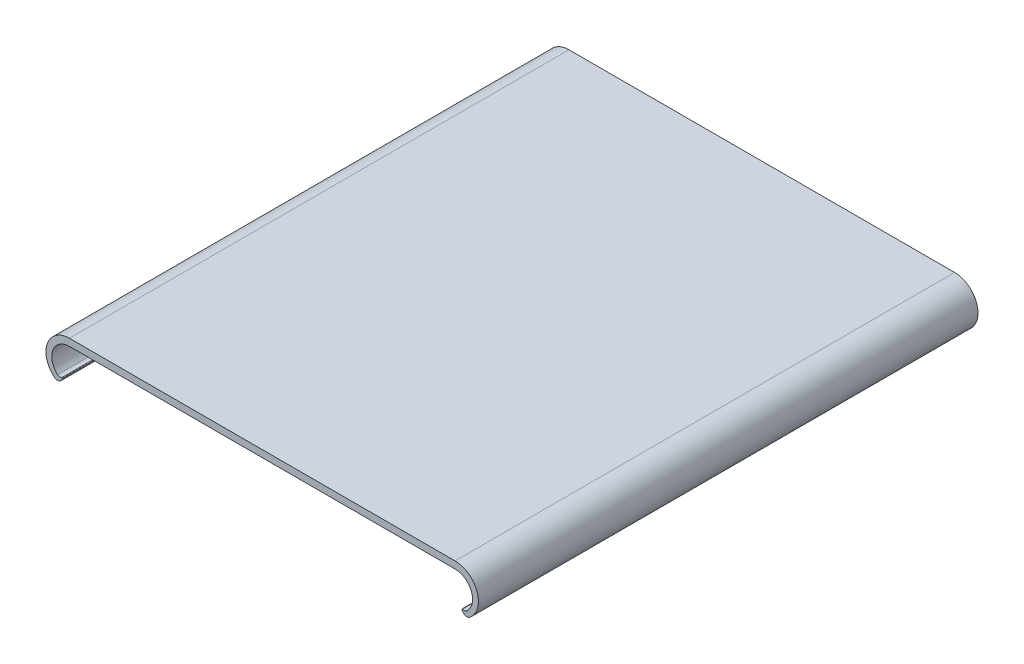
ISO-10303-21;
HEADER;
FILE_DESCRIPTION(('STEP AP214'),'2;1');
FILE_NAME('part.step','',(''),(''),'','','');
FILE_SCHEMA(('AUTOMOTIVE_DESIGN { 1 0 10303 214 1 1 1 1 }'));
ENDSEC;
DATA;
#1=APPLICATION_CONTEXT('core data for automotive mechanical design processes');
#2=APPLICATION_PROTOCOL_DEFINITION('international standard','automotive_design',2000,#1);
#3=PRODUCT_CONTEXT('',#1,'mechanical');
#4=PRODUCT('Part','Part','',(#3));
#5=PRODUCT_RELATED_PRODUCT_CATEGORY('part','',(#4));
#6=PRODUCT_DEFINITION_FORMATION('','',#4);
#7=PRODUCT_DEFINITION_CONTEXT('part definition',#1,'design');
#8=PRODUCT_DEFINITION('design','',#6,#7);
#9=PRODUCT_DEFINITION_SHAPE('','',#8);
#10=(LENGTH_UNIT() NAMED_UNIT(*) SI_UNIT(.MILLI.,.METRE.));
#11=(NAMED_UNIT(*) PLANE_ANGLE_UNIT() SI_UNIT($,.RADIAN.));
#12=(NAMED_UNIT(*) SI_UNIT($,.STERADIAN.) SOLID_ANGLE_UNIT());
#13=UNCERTAINTY_MEASURE_WITH_UNIT(LENGTH_MEASURE(1.E-05),#10,'distance_accuracy_value','');
#14=(GEOMETRIC_REPRESENTATION_CONTEXT(3) GLOBAL_UNCERTAINTY_ASSIGNED_CONTEXT((#13)) GLOBAL_UNIT_ASSIGNED_CONTEXT((#10,
#11,#12)) REPRESENTATION_CONTEXT('',''));
#15=CARTESIAN_POINT('',(0.,0.,0.));
#16=DIRECTION('',(0.,0.,1.));
#17=DIRECTION('',(1.,0.,0.));
#18=AXIS2_PLACEMENT_3D('',#15,#16,#17);
#19=CARTESIAN_POINT('',(-33.,-4.00000000000001,42.75));
#20=DIRECTION('',(0.,0.,-1.));
#21=DIRECTION('',(-1.,0.,0.));
#22=AXIS2_PLACEMENT_3D('',#19,#20,#21);
#23=CYLINDRICAL_SURFACE('',#22,3.99999999999999);
#24=CARTESIAN_POINT('',(-33.,-4.00000000000001,-42.75));
#25=DIRECTION('',(0.,0.,1.));
#26=DIRECTION('',(1.,0.,0.));
#27=AXIS2_PLACEMENT_3D('',#24,#25,#26);
#28=CIRCLE('',#27,3.99999999999999);
#29=CARTESIAN_POINT('',(-33.,0.,-42.75));
#30=VERTEX_POINT('',#29);
#31=CARTESIAN_POINT('',(-35.5813911456641,-7.05555555555562,-42.75));
#32=VERTEX_POINT('',#31);
#33=EDGE_CURVE('E164',#30,#32,#28,.T.);
#34=ORIENTED_EDGE('',*,*,#33,.T.);
#35=DIRECTION('',(0.,0.,-1.));
#36=VECTOR('',#35,1.);
#37=CARTESIAN_POINT('',(-35.5813911456641,-7.05555555555562,42.75));
#38=LINE('',#37,#36);
#39=CARTESIAN_POINT('',(-35.5813911456641,-7.05555555555562,42.75));
#40=VERTEX_POINT('',#39);
#41=EDGE_CURVE('E11',#40,#32,#38,.T.);
#42=ORIENTED_EDGE('',*,*,#41,.F.);
#43=CARTESIAN_POINT('',(-33.,-4.00000000000001,42.75));
#44=DIRECTION('',(0.,0.,1.));
#45=DIRECTION('',(1.,0.,0.));
#46=AXIS2_PLACEMENT_3D('',#43,#44,#45);
#47=CIRCLE('',#46,3.99999999999999);
#48=CARTESIAN_POINT('',(-33.,0.,42.75));
#49=VERTEX_POINT('',#48);
#50=EDGE_CURVE('E198',#49,#40,#47,.T.);
#51=ORIENTED_EDGE('',*,*,#50,.F.);
#52=DIRECTION('',(0.,0.,-1.));
#53=VECTOR('',#52,1.);
#54=CARTESIAN_POINT('',(-33.,0.,42.75));
#55=LINE('',#54,#53);
#56=EDGE_CURVE('E160',#49,#30,#55,.T.);
#57=ORIENTED_EDGE('',*,*,#56,.T.);
#58=EDGE_LOOP('',(#34,#42,#51,#57));
#59=FACE_BOUND('',#58,.T.);
#60=ADVANCED_FACE('F39',(#59),#23,.T.);
#61=CARTESIAN_POINT('',(-35.0328455272105,-6.40625000000007,42.75));
#62=DIRECTION('',(0.,0.,-1.));
#63=DIRECTION('',(-1.,0.,0.));
#64=AXIS2_PLACEMENT_3D('',#61,#62,#63);
#65=CYLINDRICAL_SURFACE('',#64,0.849999999999977);
#66=CARTESIAN_POINT('',(-35.0328455272105,-6.40625000000007,-42.75));
#67=DIRECTION('',(0.,0.,1.));
#68=DIRECTION('',(1.,0.,0.));
#69=AXIS2_PLACEMENT_3D('',#66,#67,#68);
#70=CIRCLE('',#69,0.849999999999977);
#71=CARTESIAN_POINT('',(-34.1975403046777,-6.56361958158892,-42.75));
#72=VERTEX_POINT('',#71);
#73=EDGE_CURVE('E168',#32,#72,#70,.T.);
#74=ORIENTED_EDGE('',*,*,#73,.T.);
#75=DIRECTION('',(0.,0.,-1.));
#76=VECTOR('',#75,1.);
#77=CARTESIAN_POINT('',(-34.1975403046777,-6.56361958158892,42.75));
#78=LINE('',#77,#76);
#79=CARTESIAN_POINT('',(-34.1975403046777,-6.56361958158892,42.75));
#80=VERTEX_POINT('',#79);
#81=EDGE_CURVE('E48',#80,#72,#78,.T.);
#82=ORIENTED_EDGE('',*,*,#81,.F.);
#83=CARTESIAN_POINT('',(-35.0328455272105,-6.40625000000007,42.75));
#84=DIRECTION('',(0.,0.,1.));
#85=DIRECTION('',(1.,0.,0.));
#86=AXIS2_PLACEMENT_3D('',#83,#84,#85);
#87=CIRCLE('',#86,0.849999999999977);
#88=EDGE_CURVE('E111',#40,#80,#87,.T.);
#89=ORIENTED_EDGE('',*,*,#88,.F.);
#90=ORIENTED_EDGE('',*,*,#41,.T.);
#91=EDGE_LOOP('',(#74,#82,#89,#90));
#92=FACE_BOUND('',#91,.T.);
#93=ADVANCED_FACE('F292',(#92),#65,.T.);
#94=CARTESIAN_POINT('',(-34.2761572667985,-6.54880832685115,42.75));
#95=DIRECTION('',(0.,0.,-1.));
#96=DIRECTION('',(-1.,0.,0.));
#97=AXIS2_PLACEMENT_3D('',#94,#95,#96);
#98=CYLINDRICAL_SURFACE('',#97,0.0799999999999969);
#99=CARTESIAN_POINT('',(-34.2761572667985,-6.54880832685115,-42.75));
#100=DIRECTION('',(0.,0.,1.));
#101=DIRECTION('',(1.,0.,0.));
#102=AXIS2_PLACEMENT_3D('',#99,#100,#101);
#103=CIRCLE('',#102,0.0799999999999969);
#104=CARTESIAN_POINT('',(-34.3172019661409,-6.4801400470133,-42.75));
#105=VERTEX_POINT('',#104);
#106=EDGE_CURVE('E171',#72,#105,#103,.T.);
#107=ORIENTED_EDGE('',*,*,#106,.T.);
#108=DIRECTION('',(0.,0.,-1.));
#109=VECTOR('',#108,1.);
#110=CARTESIAN_POINT('',(-34.3172019661409,-6.4801400470133,42.75));
#111=LINE('',#110,#109);
#112=CARTESIAN_POINT('',(-34.3172019661409,-6.4801400470133,42.75));
#113=VERTEX_POINT('',#112);
#114=EDGE_CURVE('E225',#113,#105,#111,.T.);
#115=ORIENTED_EDGE('',*,*,#114,.F.);
#116=CARTESIAN_POINT('',(-34.2761572667985,-6.54880832685115,42.75));
#117=DIRECTION('',(0.,0.,1.));
#118=DIRECTION('',(1.,0.,0.));
#119=AXIS2_PLACEMENT_3D('',#116,#117,#118);
#120=CIRCLE('',#119,0.0799999999999969);
#121=EDGE_CURVE('E235',#80,#113,#120,.T.);
#122=ORIENTED_EDGE('',*,*,#121,.F.);
#123=ORIENTED_EDGE('',*,*,#81,.T.);
#124=EDGE_LOOP('',(#107,#115,#122,#123));
#125=FACE_BOUND('',#124,.T.);
#126=ADVANCED_FACE('F233',(#125),#98,.T.);
#127=CARTESIAN_POINT('',(-34.6255711842818,-5.96423460480208,42.75));
#128=DIRECTION('',(0.,0.,-1.));
#129=DIRECTION('',(-1.,0.,0.));
#130=AXIS2_PLACEMENT_3D('',#127,#128,#129);
#131=CYLINDRICAL_SURFACE('',#130,0.601040764008578);
#132=CARTESIAN_POINT('',(-34.6255711842818,-5.96423460480208,-42.75));
#133=DIRECTION('',(0.,0.,-1.));
#134=DIRECTION('',(1.,0.,0.));
#135=AXIS2_PLACEMENT_3D('',#132,#133,#134);
#136=CIRCLE('',#135,0.601040764008578);
#137=CARTESIAN_POINT('',(-35.0328455272105,-6.40625000000006,-42.75));
#138=VERTEX_POINT('',#137);
#139=EDGE_CURVE('E174',#105,#138,#136,.T.);
#140=ORIENTED_EDGE('',*,*,#139,.T.);
#141=DIRECTION('',(0.,0.,-1.));
#142=VECTOR('',#141,1.);
#143=CARTESIAN_POINT('',(-35.0328455272105,-6.40625000000006,42.75));
#144=LINE('',#143,#142);
#145=CARTESIAN_POINT('',(-35.0328455272105,-6.40625000000006,42.75));
#146=VERTEX_POINT('',#145);
#147=EDGE_CURVE('E221',#146,#138,#144,.T.);
#148=ORIENTED_EDGE('',*,*,#147,.F.);
#149=CARTESIAN_POINT('',(-34.6255711842818,-5.96423460480208,42.75));
#150=DIRECTION('',(0.,0.,-1.));
#151=DIRECTION('',(1.,0.,0.));
#152=AXIS2_PLACEMENT_3D('',#149,#150,#151);
#153=CIRCLE('',#152,0.601040764008578);
#154=EDGE_CURVE('E254',#113,#146,#153,.T.);
#155=ORIENTED_EDGE('',*,*,#154,.F.);
#156=ORIENTED_EDGE('',*,*,#114,.T.);
#157=EDGE_LOOP('',(#140,#148,#155,#156));
#158=FACE_BOUND('',#157,.T.);
#159=ADVANCED_FACE('F244',(#158),#131,.F.);
#160=CARTESIAN_POINT('',(-33.,-4.20000000000001,42.75));
#161=DIRECTION('',(0.,0.,-1.));
#162=DIRECTION('',(-1.,0.,0.));
#163=AXIS2_PLACEMENT_3D('',#160,#161,#162);
#164=CYLINDRICAL_SURFACE('',#163,3.00000000000001);
#165=CARTESIAN_POINT('',(-33.,-4.20000000000001,-42.75));
#166=DIRECTION('',(0.,0.,-1.));
#167=DIRECTION('',(1.,0.,0.));
#168=AXIS2_PLACEMENT_3D('',#165,#166,#167);
#169=CIRCLE('',#168,3.00000000000001);
#170=CARTESIAN_POINT('',(-33.,-1.20000000000001,-42.75));
#171=VERTEX_POINT('',#170);
#172=EDGE_CURVE('E177',#138,#171,#169,.T.);
#173=ORIENTED_EDGE('',*,*,#172,.T.);
#174=DIRECTION('',(0.,0.,-1.));
#175=VECTOR('',#174,1.);
#176=CARTESIAN_POINT('',(-33.,-1.20000000000001,42.75));
#177=LINE('',#176,#175);
#178=CARTESIAN_POINT('',(-33.,-1.20000000000001,42.75));
#179=VERTEX_POINT('',#178);
#180=EDGE_CURVE('E217',#179,#171,#177,.T.);
#181=ORIENTED_EDGE('',*,*,#180,.F.);
#182=CARTESIAN_POINT('',(-33.,-4.20000000000001,42.75));
#183=DIRECTION('',(0.,0.,-1.));
#184=DIRECTION('',(1.,0.,0.));
#185=AXIS2_PLACEMENT_3D('',#182,#183,#184);
#186=CIRCLE('',#185,3.00000000000001);
#187=EDGE_CURVE('E250',#146,#179,#186,.T.);
#188=ORIENTED_EDGE('',*,*,#187,.F.);
#189=ORIENTED_EDGE('',*,*,#147,.T.);
#190=EDGE_LOOP('',(#173,#181,#188,#189));
#191=FACE_BOUND('',#190,.T.);
#192=ADVANCED_FACE('F248',(#191),#164,.F.);
#193=CARTESIAN_POINT('',(33.,-1.2,42.75));
#194=DIRECTION('',(0.,1.,0.));
#195=DIRECTION('',(-1.,0.,0.));
#196=AXIS2_PLACEMENT_3D('',#193,#194,#195);
#197=PLANE('',#196);
#198=DIRECTION('',(1.,0.,0.));
#199=VECTOR('',#198,1.);
#200=CARTESIAN_POINT('',(33.,-1.2,-42.75));
#201=LINE('',#200,#199);
#202=CARTESIAN_POINT('',(33.,-1.19999999999999,-42.75));
#203=VERTEX_POINT('',#202);
#204=EDGE_CURVE('E180',#171,#203,#201,.T.);
#205=ORIENTED_EDGE('',*,*,#204,.T.);
#206=DIRECTION('',(0.,0.,-1.));
#207=VECTOR('',#206,1.);
#208=CARTESIAN_POINT('',(33.,-1.19999999999999,42.75));
#209=LINE('',#208,#207);
#210=CARTESIAN_POINT('',(33.,-1.19999999999999,42.75));
#211=VERTEX_POINT('',#210);
#212=EDGE_CURVE('E213',#211,#203,#209,.T.);
#213=ORIENTED_EDGE('',*,*,#212,.F.);
#214=DIRECTION('',(1.,0.,0.));
#215=VECTOR('',#214,1.);
#216=CARTESIAN_POINT('',(33.,-1.2,42.75));
#217=LINE('',#216,#215);
#218=EDGE_CURVE('E253',#179,#211,#217,.T.);
#219=ORIENTED_EDGE('',*,*,#218,.F.);
#220=ORIENTED_EDGE('',*,*,#180,.T.);
#221=EDGE_LOOP('',(#205,#213,#219,#220));
#222=FACE_BOUND('',#221,.T.);
#223=ADVANCED_FACE('F305',(#222),#197,.F.);
#224=CARTESIAN_POINT('',(33.,-4.2,42.75));
#225=DIRECTION('',(0.,0.,-1.));
#226=DIRECTION('',(-1.,0.,0.));
#227=AXIS2_PLACEMENT_3D('',#224,#225,#226);
#228=CYLINDRICAL_SURFACE('',#227,3.00000000000001);
#229=CARTESIAN_POINT('',(33.,-4.2,-42.75));
#230=DIRECTION('',(0.,0.,-1.));
#231=DIRECTION('',(-1.,0.,0.));
#232=AXIS2_PLACEMENT_3D('',#229,#230,#231);
#233=CIRCLE('',#232,3.00000000000001);
#234=CARTESIAN_POINT('',(35.0328455272105,-6.40625000000006,-42.75));
#235=VERTEX_POINT('',#234);
#236=EDGE_CURVE('E183',#203,#235,#233,.T.);
#237=ORIENTED_EDGE('',*,*,#236,.T.);
#238=DIRECTION('',(0.,0.,-1.));
#239=VECTOR('',#238,1.);
#240=CARTESIAN_POINT('',(35.0328455272105,-6.40625000000006,42.75));
#241=LINE('',#240,#239);
#242=CARTESIAN_POINT('',(35.0328455272105,-6.40625000000006,42.75));
#243=VERTEX_POINT('',#242);
#244=EDGE_CURVE('E209',#243,#235,#241,.T.);
#245=ORIENTED_EDGE('',*,*,#244,.F.);
#246=CARTESIAN_POINT('',(33.,-4.2,42.75));
#247=DIRECTION('',(0.,0.,-1.));
#248=DIRECTION('',(-1.,0.,0.));
#249=AXIS2_PLACEMENT_3D('',#246,#247,#248);
#250=CIRCLE('',#249,3.00000000000001);
#251=EDGE_CURVE('E258',#211,#243,#250,.T.);
#252=ORIENTED_EDGE('',*,*,#251,.F.);
#253=ORIENTED_EDGE('',*,*,#212,.T.);
#254=EDGE_LOOP('',(#237,#245,#252,#253));
#255=FACE_BOUND('',#254,.T.);
#256=ADVANCED_FACE('F308',(#255),#228,.F.);
#257=CARTESIAN_POINT('',(34.6255711842819,-5.96423460480207,42.75));
#258=DIRECTION('',(0.,0.,-1.));
#259=DIRECTION('',(-1.,0.,0.));
#260=AXIS2_PLACEMENT_3D('',#257,#258,#259);
#261=CYLINDRICAL_SURFACE('',#260,0.601040764008578);
#262=CARTESIAN_POINT('',(34.6255711842819,-5.96423460480207,-42.75));
#263=DIRECTION('',(0.,0.,-1.));
#264=DIRECTION('',(-1.,0.,0.));
#265=AXIS2_PLACEMENT_3D('',#262,#263,#264);
#266=CIRCLE('',#265,0.601040764008578);
#267=CARTESIAN_POINT('',(34.3172019661409,-6.48014004701329,-42.75));
#268=VERTEX_POINT('',#267);
#269=EDGE_CURVE('E186',#235,#268,#266,.T.);
#270=ORIENTED_EDGE('',*,*,#269,.T.);
#271=DIRECTION('',(0.,0.,-1.));
#272=VECTOR('',#271,1.);
#273=CARTESIAN_POINT('',(34.3172019661409,-6.48014004701329,42.75));
#274=LINE('',#273,#272);
#275=CARTESIAN_POINT('',(34.3172019661409,-6.48014004701329,42.75));
#276=VERTEX_POINT('',#275);
#277=EDGE_CURVE('E205',#276,#268,#274,.T.);
#278=ORIENTED_EDGE('',*,*,#277,.F.);
#279=CARTESIAN_POINT('',(34.6255711842819,-5.96423460480207,42.75));
#280=DIRECTION('',(0.,0.,-1.));
#281=DIRECTION('',(-1.,0.,0.));
#282=AXIS2_PLACEMENT_3D('',#279,#280,#281);
#283=CIRCLE('',#282,0.601040764008578);
#284=EDGE_CURVE('E265',#243,#276,#283,.T.);
#285=ORIENTED_EDGE('',*,*,#284,.F.);
#286=ORIENTED_EDGE('',*,*,#244,.T.);
#287=EDGE_LOOP('',(#270,#278,#285,#286));
#288=FACE_BOUND('',#287,.T.);
#289=ADVANCED_FACE('F273',(#288),#261,.F.);
#290=CARTESIAN_POINT('',(34.2761572667985,-6.54880832685114,42.75));
#291=DIRECTION('',(0.,0.,-1.));
#292=DIRECTION('',(-1.,0.,0.));
#293=AXIS2_PLACEMENT_3D('',#290,#291,#292);
#294=CYLINDRICAL_SURFACE('',#293,0.0799999999999969);
#295=CARTESIAN_POINT('',(34.2761572667985,-6.54880832685114,-42.75));
#296=DIRECTION('',(0.,0.,1.));
#297=DIRECTION('',(-1.,0.,0.));
#298=AXIS2_PLACEMENT_3D('',#295,#296,#297);
#299=CIRCLE('',#298,0.0799999999999969);
#300=CARTESIAN_POINT('',(34.1975403046778,-6.56361958158891,-42.75));
#301=VERTEX_POINT('',#300);
#302=EDGE_CURVE('E189',#268,#301,#299,.T.);
#303=ORIENTED_EDGE('',*,*,#302,.T.);
#304=DIRECTION('',(0.,0.,-1.));
#305=VECTOR('',#304,1.);
#306=CARTESIAN_POINT('',(34.1975403046778,-6.56361958158891,42.75));
#307=LINE('',#306,#305);
#308=CARTESIAN_POINT('',(34.1975403046778,-6.56361958158891,42.75));
#309=VERTEX_POINT('',#308);
#310=EDGE_CURVE('E153',#309,#301,#307,.T.);
#311=ORIENTED_EDGE('',*,*,#310,.F.);
#312=CARTESIAN_POINT('',(34.2761572667985,-6.54880832685114,42.75));
#313=DIRECTION('',(0.,0.,1.));
#314=DIRECTION('',(-1.,0.,0.));
#315=AXIS2_PLACEMENT_3D('',#312,#313,#314);
#316=CIRCLE('',#315,0.0799999999999969);
#317=EDGE_CURVE('E142',#276,#309,#316,.T.);
#318=ORIENTED_EDGE('',*,*,#317,.F.);
#319=ORIENTED_EDGE('',*,*,#277,.T.);
#320=EDGE_LOOP('',(#303,#311,#318,#319));
#321=FACE_BOUND('',#320,.T.);
#322=ADVANCED_FACE('F277',(#321),#294,.T.);
#323=CARTESIAN_POINT('',(35.0328455272105,-6.40625000000006,42.75));
#324=DIRECTION('',(0.,0.,-1.));
#325=DIRECTION('',(-1.,0.,0.));
#326=AXIS2_PLACEMENT_3D('',#323,#324,#325);
#327=CYLINDRICAL_SURFACE('',#326,0.849999999999977);
#328=CARTESIAN_POINT('',(35.0328455272105,-6.40625000000006,-42.75));
#329=DIRECTION('',(0.,0.,1.));
#330=DIRECTION('',(-1.,0.,0.));
#331=AXIS2_PLACEMENT_3D('',#328,#329,#330);
#332=CIRCLE('',#331,0.849999999999977);
#333=CARTESIAN_POINT('',(35.5813911456641,-7.05555555555561,-42.75));
#334=VERTEX_POINT('',#333);
#335=EDGE_CURVE('E151',#301,#334,#332,.T.);
#336=ORIENTED_EDGE('',*,*,#335,.T.);
#337=DIRECTION('',(0.,0.,-1.));
#338=VECTOR('',#337,1.);
#339=CARTESIAN_POINT('',(35.5813911456641,-7.05555555555561,42.75));
#340=LINE('',#339,#338);
#341=CARTESIAN_POINT('',(35.5813911456641,-7.05555555555561,42.75));
#342=VERTEX_POINT('',#341);
#343=EDGE_CURVE('E148',#342,#334,#340,.T.);
#344=ORIENTED_EDGE('',*,*,#343,.F.);
#345=CARTESIAN_POINT('',(35.0328455272105,-6.40625000000006,42.75));
#346=DIRECTION('',(0.,0.,1.));
#347=DIRECTION('',(-1.,0.,0.));
#348=AXIS2_PLACEMENT_3D('',#345,#346,#347);
#349=CIRCLE('',#348,0.849999999999977);
#350=EDGE_CURVE('E136',#309,#342,#349,.T.);
#351=ORIENTED_EDGE('',*,*,#350,.F.);
#352=ORIENTED_EDGE('',*,*,#310,.T.);
#353=EDGE_LOOP('',(#336,#344,#351,#352));
#354=FACE_BOUND('',#353,.T.);
#355=ADVANCED_FACE('F149',(#354),#327,.T.);
#356=CARTESIAN_POINT('',(33.,-4.,42.75));
#357=DIRECTION('',(0.,0.,-1.));
#358=DIRECTION('',(-1.,0.,0.));
#359=AXIS2_PLACEMENT_3D('',#356,#357,#358);
#360=CYLINDRICAL_SURFACE('',#359,3.99999999999999);
#361=CARTESIAN_POINT('',(33.,-4.,-42.75));
#362=DIRECTION('',(0.,0.,1.));
#363=DIRECTION('',(-1.,0.,0.));
#364=AXIS2_PLACEMENT_3D('',#361,#362,#363);
#365=CIRCLE('',#364,3.99999999999999);
#366=CARTESIAN_POINT('',(33.,0.,-42.75));
#367=VERTEX_POINT('',#366);
#368=EDGE_CURVE('E97',#334,#367,#365,.T.);
#369=ORIENTED_EDGE('',*,*,#368,.T.);
#370=DIRECTION('',(0.,0.,-1.));
#371=VECTOR('',#370,1.);
#372=CARTESIAN_POINT('',(33.,0.,42.75));
#373=LINE('',#372,#371);
#374=CARTESIAN_POINT('',(33.,0.,42.75));
#375=VERTEX_POINT('',#374);
#376=EDGE_CURVE('E154',#375,#367,#373,.T.);
#377=ORIENTED_EDGE('',*,*,#376,.F.);
#378=CARTESIAN_POINT('',(33.,-4.,42.75));
#379=DIRECTION('',(0.,0.,1.));
#380=DIRECTION('',(-1.,0.,0.));
#381=AXIS2_PLACEMENT_3D('',#378,#379,#380);
#382=CIRCLE('',#381,3.99999999999999);
#383=EDGE_CURVE('E140',#342,#375,#382,.T.);
#384=ORIENTED_EDGE('',*,*,#383,.F.);
#385=ORIENTED_EDGE('',*,*,#343,.T.);
#386=EDGE_LOOP('',(#369,#377,#384,#385));
#387=FACE_BOUND('',#386,.T.);
#388=ADVANCED_FACE('F156',(#387),#360,.T.);
#389=CARTESIAN_POINT('',(33.,0.,42.75));
#390=DIRECTION('',(0.,-1.,0.));
#391=DIRECTION('',(1.,0.,0.));
#392=AXIS2_PLACEMENT_3D('',#389,#390,#391);
#393=PLANE('',#392);
#394=DIRECTION('',(-1.,0.,0.));
#395=VECTOR('',#394,1.);
#396=CARTESIAN_POINT('',(33.,0.,-42.75));
#397=LINE('',#396,#395);
#398=EDGE_CURVE('E103',#367,#30,#397,.T.);
#399=ORIENTED_EDGE('',*,*,#398,.T.);
#400=ORIENTED_EDGE('',*,*,#56,.F.);
#401=DIRECTION('',(-1.,0.,0.));
#402=VECTOR('',#401,1.);
#403=CARTESIAN_POINT('',(33.,0.,42.75));
#404=LINE('',#403,#402);
#405=EDGE_CURVE('E56',#375,#49,#404,.T.);
#406=ORIENTED_EDGE('',*,*,#405,.F.);
#407=ORIENTED_EDGE('',*,*,#376,.T.);
#408=EDGE_LOOP('',(#399,#400,#406,#407));
#409=FACE_BOUND('',#408,.T.);
#410=ADVANCED_FACE('F281',(#409),#393,.F.);
#411=CARTESIAN_POINT('',(-33.,-4.00000000000001,42.75));
#412=DIRECTION('',(0.,0.,1.));
#413=DIRECTION('',(1.,0.,0.));
#414=AXIS2_PLACEMENT_3D('',#411,#412,#413);
#415=PLANE('',#414);
#416=ORIENTED_EDGE('',*,*,#50,.T.);
#417=ORIENTED_EDGE('',*,*,#88,.T.);
#418=ORIENTED_EDGE('',*,*,#121,.T.);
#419=ORIENTED_EDGE('',*,*,#154,.T.);
#420=ORIENTED_EDGE('',*,*,#187,.T.);
#421=ORIENTED_EDGE('',*,*,#218,.T.);
#422=ORIENTED_EDGE('',*,*,#251,.T.);
#423=ORIENTED_EDGE('',*,*,#284,.T.);
#424=ORIENTED_EDGE('',*,*,#317,.T.);
#425=ORIENTED_EDGE('',*,*,#350,.T.);
#426=ORIENTED_EDGE('',*,*,#383,.T.);
#427=ORIENTED_EDGE('',*,*,#405,.T.);
#428=EDGE_LOOP('',(#416,#417,#418,#419,#420,#421,#422,#423,#424,#425,#426,#427));
#429=FACE_BOUND('',#428,.T.);
#430=ADVANCED_FACE('F138',(#429),#415,.T.);
#431=CARTESIAN_POINT('',(-33.,-4.00000000000001,-42.75));
#432=DIRECTION('',(0.,0.,1.));
#433=DIRECTION('',(1.,0.,0.));
#434=AXIS2_PLACEMENT_3D('',#431,#432,#433);
#435=PLANE('',#434);
#436=ORIENTED_EDGE('',*,*,#33,.F.);
#437=ORIENTED_EDGE('',*,*,#398,.F.);
#438=ORIENTED_EDGE('',*,*,#368,.F.);
#439=ORIENTED_EDGE('',*,*,#335,.F.);
#440=ORIENTED_EDGE('',*,*,#302,.F.);
#441=ORIENTED_EDGE('',*,*,#269,.F.);
#442=ORIENTED_EDGE('',*,*,#236,.F.);
#443=ORIENTED_EDGE('',*,*,#204,.F.);
#444=ORIENTED_EDGE('',*,*,#172,.F.);
#445=ORIENTED_EDGE('',*,*,#139,.F.);
#446=ORIENTED_EDGE('',*,*,#106,.F.);
#447=ORIENTED_EDGE('',*,*,#73,.F.);
#448=EDGE_LOOP('',(#436,#437,#438,#439,#440,#441,#442,#443,#444,#445,#446,#447));
#449=FACE_BOUND('',#448,.T.);
#450=ADVANCED_FACE('F239',(#449),#435,.F.);
#451=CLOSED_SHELL('',(#60,#93,#126,#159,#192,#223,#256,#289,#322,#355,#388,#410,#430,#450));
#452=MANIFOLD_SOLID_BREP('B2',#451);
#453=ADVANCED_BREP_SHAPE_REPRESENTATION('',(#18,#452),#14);
#454=SHAPE_DEFINITION_REPRESENTATION(#9,#453);
ENDSEC;
END-ISO-10303-21;
